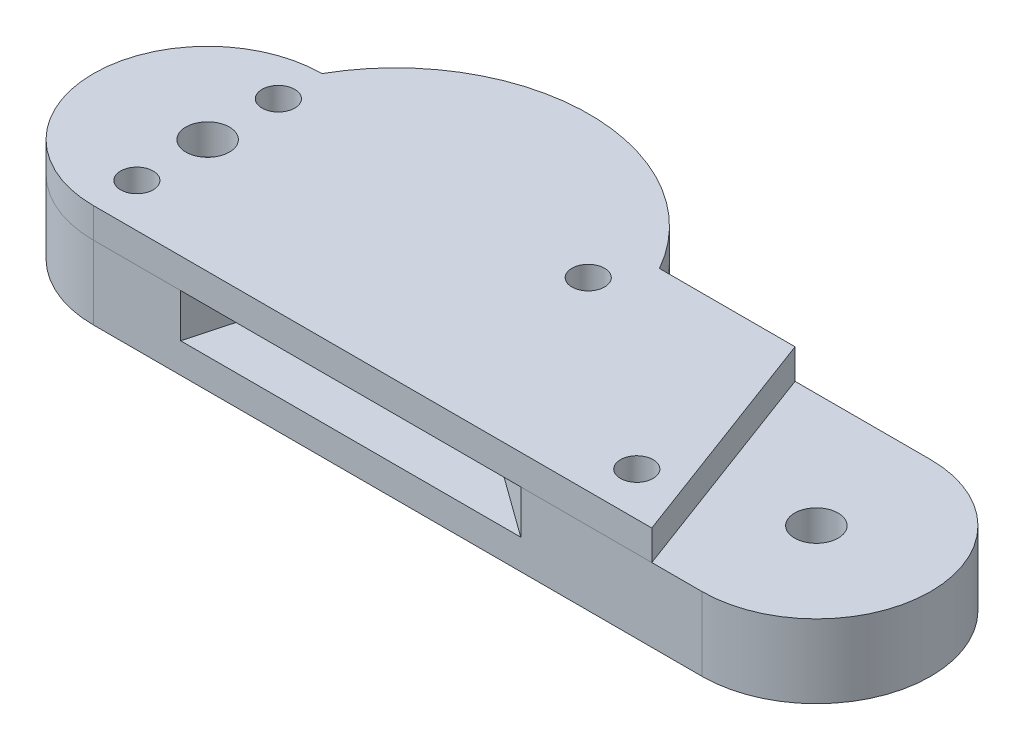
ISO-10303-21;
HEADER;
FILE_DESCRIPTION(('STEP AP214'),'2;1');
FILE_NAME('part.step','',(''),(''),'','','');
FILE_SCHEMA(('AUTOMOTIVE_DESIGN { 1 0 10303 214 1 1 1 1 }'));
ENDSEC;
DATA;
#1=APPLICATION_CONTEXT('core data for automotive mechanical design processes');
#2=APPLICATION_PROTOCOL_DEFINITION('international standard','automotive_design',2000,#1);
#3=PRODUCT_CONTEXT('',#1,'mechanical');
#4=PRODUCT('Part','Part','',(#3));
#5=PRODUCT_RELATED_PRODUCT_CATEGORY('part','',(#4));
#6=PRODUCT_DEFINITION_FORMATION('','',#4);
#7=PRODUCT_DEFINITION_CONTEXT('part definition',#1,'design');
#8=PRODUCT_DEFINITION('design','',#6,#7);
#9=PRODUCT_DEFINITION_SHAPE('','',#8);
#10=(LENGTH_UNIT() NAMED_UNIT(*) SI_UNIT(.MILLI.,.METRE.));
#11=(NAMED_UNIT(*) PLANE_ANGLE_UNIT() SI_UNIT($,.RADIAN.));
#12=(NAMED_UNIT(*) SI_UNIT($,.STERADIAN.) SOLID_ANGLE_UNIT());
#13=UNCERTAINTY_MEASURE_WITH_UNIT(LENGTH_MEASURE(1.E-05),#10,'distance_accuracy_value','');
#14=(GEOMETRIC_REPRESENTATION_CONTEXT(3) GLOBAL_UNCERTAINTY_ASSIGNED_CONTEXT((#13)) GLOBAL_UNIT_ASSIGNED_CONTEXT((#10,
#11,#12)) REPRESENTATION_CONTEXT('',''));
#15=CARTESIAN_POINT('',(0.,0.,0.));
#16=DIRECTION('',(0.,0.,1.));
#17=DIRECTION('',(1.,0.,0.));
#18=AXIS2_PLACEMENT_3D('',#15,#16,#17);
#19=CARTESIAN_POINT('',(0.,2.,0.));
#20=DIRECTION('',(0.,-1.,0.));
#21=DIRECTION('',(0.,0.,-1.));
#22=AXIS2_PLACEMENT_3D('',#19,#20,#21);
#23=PLANE('',#22);
#24=CARTESIAN_POINT('',(-40.4241193156667,2.,-1.7460511013579));
#25=DIRECTION('',(0.,1.,0.));
#26=DIRECTION('',(0.,0.,1.));
#27=AXIS2_PLACEMENT_3D('',#24,#25,#26);
#28=CIRCLE('',#27,17.8069548217708);
#29=CARTESIAN_POINT('',(-24.917700351162,2.,-10.5003992165423));
#30=VERTEX_POINT('',#29);
#31=CARTESIAN_POINT('',(-55.9305382801715,2.,-10.5003992165423));
#32=VERTEX_POINT('',#31);
#33=EDGE_CURVE('E153',#30,#32,#28,.T.);
#34=ORIENTED_EDGE('',*,*,#33,.F.);
#35=DIRECTION('',(1.,0.,0.));
#36=VECTOR('',#35,1.);
#37=CARTESIAN_POINT('',(0.,2.,-10.5003992165423));
#38=LINE('',#37,#36);
#39=CARTESIAN_POINT('',(-12.458850175581,2.,-10.5003992165423));
#40=VERTEX_POINT('',#39);
#41=EDGE_CURVE('E118',#30,#40,#38,.T.);
#42=ORIENTED_EDGE('',*,*,#41,.T.);
#43=DIRECTION('',(-0.349715205744596,0.,-0.93685605877905));
#44=VECTOR('',#43,1.);
#45=CARTESIAN_POINT('',(-12.458850175581,2.,-10.5003992165423));
#46=LINE('',#45,#44);
#47=CARTESIAN_POINT('',(-4.6195471407067,2.,10.5003992165423));
#48=VERTEX_POINT('',#47);
#49=EDGE_CURVE('E103',#48,#40,#46,.T.);
#50=ORIENTED_EDGE('',*,*,#49,.F.);
#51=DIRECTION('',(1.,0.,0.));
#52=VECTOR('',#51,1.);
#53=CARTESIAN_POINT('',(0.,2.,10.5003992165423));
#54=LINE('',#53,#52);
#55=CARTESIAN_POINT('',(-55.9305382801715,2.,10.5003992165423));
#56=VERTEX_POINT('',#55);
#57=EDGE_CURVE('E97',#56,#48,#54,.T.);
#58=ORIENTED_EDGE('',*,*,#57,.F.);
#59=CARTESIAN_POINT('',(-55.9305382801715,2.,0.));
#60=DIRECTION('',(0.,-1.,0.));
#61=DIRECTION('',(0.,0.,-1.));
#62=AXIS2_PLACEMENT_3D('',#59,#60,#61);
#63=CIRCLE('',#62,10.5003992165423);
#64=EDGE_CURVE('E101',#56,#32,#63,.T.);
#65=ORIENTED_EDGE('',*,*,#64,.T.);
#66=EDGE_LOOP('',(#34,#42,#50,#58,#65));
#67=FACE_BOUND('',#66,.T.);
#68=CARTESIAN_POINT('',(-55.9305382801715,2.,6.5003992165423));
#69=DIRECTION('',(0.,-1.,0.));
#70=DIRECTION('',(0.,0.,-1.));
#71=AXIS2_PLACEMENT_3D('',#68,#69,#70);
#72=CIRCLE('',#71,1.5);
#73=CARTESIAN_POINT('',(-55.9305382801715,2.,5.0003992165423));
#74=VERTEX_POINT('',#73);
#75=EDGE_CURVE('E126',#74,#74,#72,.F.);
#76=ORIENTED_EDGE('',*,*,#75,.T.);
#77=EDGE_LOOP('',(#76));
#78=FACE_BOUND('',#77,.T.);
#79=CARTESIAN_POINT('',(-55.9305382801715,2.,0.));
#80=DIRECTION('',(0.,-1.,0.));
#81=DIRECTION('',(0.,0.,-1.));
#82=AXIS2_PLACEMENT_3D('',#79,#80,#81);
#83=CIRCLE('',#82,2.);
#84=CARTESIAN_POINT('',(-55.9305382801715,2.,-2.));
#85=VERTEX_POINT('',#84);
#86=EDGE_CURVE('E106',#85,#85,#83,.T.);
#87=ORIENTED_EDGE('',*,*,#86,.F.);
#88=EDGE_LOOP('',(#87));
#89=FACE_BOUND('',#88,.T.);
#90=CARTESIAN_POINT('',(-55.9305382801715,2.,-6.5003992165423));
#91=DIRECTION('',(0.,-1.,0.));
#92=DIRECTION('',(0.,0.,-1.));
#93=AXIS2_PLACEMENT_3D('',#90,#91,#92);
#94=CIRCLE('',#93,1.5);
#95=CARTESIAN_POINT('',(-55.9305382801715,2.,-8.00039921654231));
#96=VERTEX_POINT('',#95);
#97=EDGE_CURVE('E120',#96,#96,#94,.F.);
#98=ORIENTED_EDGE('',*,*,#97,.T.);
#99=EDGE_LOOP('',(#98));
#100=FACE_BOUND('',#99,.T.);
#101=CARTESIAN_POINT('',(-27.4615510728353,2.,-6.5003992165423));
#102=DIRECTION('',(0.,-1.,0.));
#103=DIRECTION('',(0.,0.,-1.));
#104=AXIS2_PLACEMENT_3D('',#101,#102,#103);
#105=CIRCLE('',#104,1.5);
#106=CARTESIAN_POINT('',(-27.4615510728353,2.,-8.00039921654231));
#107=VERTEX_POINT('',#106);
#108=EDGE_CURVE('E132',#107,#107,#105,.F.);
#109=ORIENTED_EDGE('',*,*,#108,.T.);
#110=EDGE_LOOP('',(#109));
#111=FACE_BOUND('',#110,.T.);
#112=CARTESIAN_POINT('',(-10.,2.,6.5003992165423));
#113=DIRECTION('',(0.,-1.,0.));
#114=DIRECTION('',(0.,0.,-1.));
#115=AXIS2_PLACEMENT_3D('',#112,#113,#114);
#116=CIRCLE('',#115,1.5);
#117=CARTESIAN_POINT('',(-10.,2.,5.0003992165423));
#118=VERTEX_POINT('',#117);
#119=EDGE_CURVE('E129',#118,#118,#116,.F.);
#120=ORIENTED_EDGE('',*,*,#119,.T.);
#121=EDGE_LOOP('',(#120));
#122=FACE_BOUND('',#121,.T.);
#123=ADVANCED_FACE('F52',(#67,#78,#89,#100,#111,#122),#23,.T.);
#124=CARTESIAN_POINT('',(0.,4.75,10.5003992165423));
#125=DIRECTION('',(0.,0.,-1.));
#126=DIRECTION('',(-1.,0.,0.));
#127=AXIS2_PLACEMENT_3D('',#124,#125,#126);
#128=PLANE('',#127);
#129=ORIENTED_EDGE('',*,*,#57,.T.);
#130=DIRECTION('',(0.,1.,0.));
#131=VECTOR('',#130,1.);
#132=CARTESIAN_POINT('',(-4.6195471407067,-29.1152802892206,10.5003992165423));
#133=LINE('',#132,#131);
#134=CARTESIAN_POINT('',(-4.6195471407067,4.75,10.5003992165423));
#135=VERTEX_POINT('',#134);
#136=EDGE_CURVE('E137',#48,#135,#133,.T.);
#137=ORIENTED_EDGE('',*,*,#136,.T.);
#138=DIRECTION('',(1.,0.,0.));
#139=VECTOR('',#138,1.);
#140=CARTESIAN_POINT('',(0.,4.75,10.5003992165423));
#141=LINE('',#140,#139);
#142=CARTESIAN_POINT('',(-55.9305382801715,4.75,10.5003992165423));
#143=VERTEX_POINT('',#142);
#144=EDGE_CURVE('E113',#143,#135,#141,.T.);
#145=ORIENTED_EDGE('',*,*,#144,.F.);
#146=DIRECTION('',(0.,-1.,0.));
#147=VECTOR('',#146,1.);
#148=CARTESIAN_POINT('',(-55.9305382801715,4.75,10.5003992165423));
#149=LINE('',#148,#147);
#150=EDGE_CURVE('E110',#143,#56,#149,.T.);
#151=ORIENTED_EDGE('',*,*,#150,.T.);
#152=EDGE_LOOP('',(#129,#137,#145,#151));
#153=FACE_BOUND('',#152,.T.);
#154=ADVANCED_FACE('F111',(#153),#128,.F.);
#155=CARTESIAN_POINT('',(0.,4.75,0.));
#156=DIRECTION('',(0.,1.,0.));
#157=DIRECTION('',(0.,0.,1.));
#158=AXIS2_PLACEMENT_3D('',#155,#156,#157);
#159=PLANE('',#158);
#160=DIRECTION('',(0.349715205744595,0.,0.93685605877905));
#161=VECTOR('',#160,1.);
#162=CARTESIAN_POINT('',(-12.458850175581,4.75,-10.5003992165423));
#163=LINE('',#162,#161);
#164=CARTESIAN_POINT('',(-12.458850175581,4.75,-10.5003992165423));
#165=VERTEX_POINT('',#164);
#166=EDGE_CURVE('E13',#165,#135,#163,.T.);
#167=ORIENTED_EDGE('',*,*,#166,.F.);
#168=DIRECTION('',(-1.,0.,0.));
#169=VECTOR('',#168,1.);
#170=CARTESIAN_POINT('',(0.,4.75,-10.5003992165423));
#171=LINE('',#170,#169);
#172=CARTESIAN_POINT('',(-24.917700351162,4.75,-10.5003992165423));
#173=VERTEX_POINT('',#172);
#174=EDGE_CURVE('E161',#165,#173,#171,.T.);
#175=ORIENTED_EDGE('',*,*,#174,.T.);
#176=CARTESIAN_POINT('',(-40.4241193156667,4.75,-1.7460511013579));
#177=DIRECTION('',(0.,1.,0.));
#178=DIRECTION('',(0.,0.,1.));
#179=AXIS2_PLACEMENT_3D('',#176,#177,#178);
#180=CIRCLE('',#179,17.8069548217708);
#181=CARTESIAN_POINT('',(-55.9305382801715,4.75,-10.5003992165423));
#182=VERTEX_POINT('',#181);
#183=EDGE_CURVE('E155',#173,#182,#180,.T.);
#184=ORIENTED_EDGE('',*,*,#183,.T.);
#185=CARTESIAN_POINT('',(-55.9305382801715,4.75,0.));
#186=DIRECTION('',(0.,1.,0.));
#187=DIRECTION('',(0.,0.,1.));
#188=AXIS2_PLACEMENT_3D('',#185,#186,#187);
#189=CIRCLE('',#188,10.5003992165423);
#190=EDGE_CURVE('E163',#182,#143,#189,.T.);
#191=ORIENTED_EDGE('',*,*,#190,.T.);
#192=ORIENTED_EDGE('',*,*,#144,.T.);
#193=EDGE_LOOP('',(#167,#175,#184,#191,#192));
#194=FACE_BOUND('',#193,.T.);
#195=CARTESIAN_POINT('',(-55.9305382801715,4.75,-6.5003992165423));
#196=DIRECTION('',(0.,-1.,0.));
#197=DIRECTION('',(0.,0.,-1.));
#198=AXIS2_PLACEMENT_3D('',#195,#196,#197);
#199=CIRCLE('',#198,1.5);
#200=CARTESIAN_POINT('',(-55.9305382801715,4.75,-8.00039921654231));
#201=VERTEX_POINT('',#200);
#202=EDGE_CURVE('E138',#201,#201,#199,.T.);
#203=ORIENTED_EDGE('',*,*,#202,.T.);
#204=EDGE_LOOP('',(#203));
#205=FACE_BOUND('',#204,.T.);
#206=CARTESIAN_POINT('',(-55.9305382801715,4.75,6.5003992165423));
#207=DIRECTION('',(0.,-1.,0.));
#208=DIRECTION('',(0.,0.,-1.));
#209=AXIS2_PLACEMENT_3D('',#206,#207,#208);
#210=CIRCLE('',#209,1.5);
#211=CARTESIAN_POINT('',(-55.9305382801715,4.75,5.0003992165423));
#212=VERTEX_POINT('',#211);
#213=EDGE_CURVE('E145',#212,#212,#210,.T.);
#214=ORIENTED_EDGE('',*,*,#213,.T.);
#215=EDGE_LOOP('',(#214));
#216=FACE_BOUND('',#215,.T.);
#217=CARTESIAN_POINT('',(-10.,4.75,6.5003992165423));
#218=DIRECTION('',(0.,-1.,0.));
#219=DIRECTION('',(0.,0.,-1.));
#220=AXIS2_PLACEMENT_3D('',#217,#218,#219);
#221=CIRCLE('',#220,1.5);
#222=CARTESIAN_POINT('',(-10.,4.75,5.0003992165423));
#223=VERTEX_POINT('',#222);
#224=EDGE_CURVE('E142',#223,#223,#221,.T.);
#225=ORIENTED_EDGE('',*,*,#224,.T.);
#226=EDGE_LOOP('',(#225));
#227=FACE_BOUND('',#226,.T.);
#228=CARTESIAN_POINT('',(-27.4615510728353,4.75,-6.5003992165423));
#229=DIRECTION('',(0.,-1.,0.));
#230=DIRECTION('',(0.,0.,-1.));
#231=AXIS2_PLACEMENT_3D('',#228,#229,#230);
#232=CIRCLE('',#231,1.5);
#233=CARTESIAN_POINT('',(-27.4615510728353,4.75,-8.00039921654231));
#234=VERTEX_POINT('',#233);
#235=EDGE_CURVE('E146',#234,#234,#232,.T.);
#236=ORIENTED_EDGE('',*,*,#235,.T.);
#237=EDGE_LOOP('',(#236));
#238=FACE_BOUND('',#237,.T.);
#239=CARTESIAN_POINT('',(-55.9305382801715,4.75,0.));
#240=DIRECTION('',(0.,1.,0.));
#241=DIRECTION('',(0.,0.,1.));
#242=AXIS2_PLACEMENT_3D('',#239,#240,#241);
#243=CIRCLE('',#242,2.);
#244=CARTESIAN_POINT('',(-55.9305382801715,4.75,2.));
#245=VERTEX_POINT('',#244);
#246=EDGE_CURVE('E158',#245,#245,#243,.T.);
#247=ORIENTED_EDGE('',*,*,#246,.F.);
#248=EDGE_LOOP('',(#247));
#249=FACE_BOUND('',#248,.T.);
#250=ADVANCED_FACE('F166',(#194,#205,#216,#227,#238,#249),#159,.T.);
#251=CARTESIAN_POINT('',(0.,4.75,-10.5003992165423));
#252=DIRECTION('',(0.,0.,1.));
#253=DIRECTION('',(1.,0.,0.));
#254=AXIS2_PLACEMENT_3D('',#251,#252,#253);
#255=PLANE('',#254);
#256=ORIENTED_EDGE('',*,*,#41,.F.);
#257=DIRECTION('',(0.,-1.,0.));
#258=VECTOR('',#257,1.);
#259=CARTESIAN_POINT('',(-24.917700351162,37.0570550282,-10.5003992165423));
#260=LINE('',#259,#258);
#261=EDGE_CURVE('E56',#173,#30,#260,.T.);
#262=ORIENTED_EDGE('',*,*,#261,.F.);
#263=ORIENTED_EDGE('',*,*,#174,.F.);
#264=DIRECTION('',(0.,1.,0.));
#265=VECTOR('',#264,1.);
#266=CARTESIAN_POINT('',(-12.458850175581,-29.1152802892206,-10.5003992165423));
#267=LINE('',#266,#265);
#268=EDGE_CURVE('E61',#40,#165,#267,.T.);
#269=ORIENTED_EDGE('',*,*,#268,.F.);
#270=EDGE_LOOP('',(#256,#262,#263,#269));
#271=FACE_BOUND('',#270,.T.);
#272=ADVANCED_FACE('F176',(#271),#255,.F.);
#273=CARTESIAN_POINT('',(-12.458850175581,-29.1152802892206,-10.5003992165423));
#274=DIRECTION('',(-0.93685605877905,0.,0.349715205744596));
#275=DIRECTION('',(0.349715205744596,0.,0.93685605877905));
#276=AXIS2_PLACEMENT_3D('',#273,#274,#275);
#277=PLANE('',#276);
#278=ORIENTED_EDGE('',*,*,#49,.T.);
#279=ORIENTED_EDGE('',*,*,#268,.T.);
#280=ORIENTED_EDGE('',*,*,#166,.T.);
#281=ORIENTED_EDGE('',*,*,#136,.F.);
#282=EDGE_LOOP('',(#278,#279,#280,#281));
#283=FACE_BOUND('',#282,.T.);
#284=ADVANCED_FACE('F178',(#283),#277,.F.);
#285=CARTESIAN_POINT('',(-55.9305382801715,4.75,0.));
#286=DIRECTION('',(0.,-1.,0.));
#287=DIRECTION('',(0.,0.,-1.));
#288=AXIS2_PLACEMENT_3D('',#285,#286,#287);
#289=CYLINDRICAL_SURFACE('',#288,10.5003992165423);
#290=ORIENTED_EDGE('',*,*,#64,.F.);
#291=ORIENTED_EDGE('',*,*,#150,.F.);
#292=ORIENTED_EDGE('',*,*,#190,.F.);
#293=DIRECTION('',(0.,-1.,0.));
#294=VECTOR('',#293,1.);
#295=CARTESIAN_POINT('',(-55.9305382801715,4.75,-10.5003992165423));
#296=LINE('',#295,#294);
#297=EDGE_CURVE('E105',#182,#32,#296,.T.);
#298=ORIENTED_EDGE('',*,*,#297,.T.);
#299=EDGE_LOOP('',(#290,#291,#292,#298));
#300=FACE_BOUND('',#299,.T.);
#301=ADVANCED_FACE('F117',(#300),#289,.T.);
#302=CARTESIAN_POINT('',(-40.4241193156667,37.0570550282,-1.7460511013579));
#303=DIRECTION('',(0.,-1.,0.));
#304=DIRECTION('',(0.,0.,-1.));
#305=AXIS2_PLACEMENT_3D('',#302,#303,#304);
#306=CYLINDRICAL_SURFACE('',#305,17.8069548217708);
#307=ORIENTED_EDGE('',*,*,#261,.T.);
#308=ORIENTED_EDGE('',*,*,#33,.T.);
#309=ORIENTED_EDGE('',*,*,#297,.F.);
#310=ORIENTED_EDGE('',*,*,#183,.F.);
#311=EDGE_LOOP('',(#307,#308,#309,#310));
#312=FACE_BOUND('',#311,.T.);
#313=ADVANCED_FACE('F173',(#312),#306,.T.);
#314=CARTESIAN_POINT('',(-55.9305382801715,4.75,0.));
#315=DIRECTION('',(0.,-1.,0.));
#316=DIRECTION('',(0.,0.,-1.));
#317=AXIS2_PLACEMENT_3D('',#314,#315,#316);
#318=CYLINDRICAL_SURFACE('',#317,2.);
#319=ORIENTED_EDGE('',*,*,#246,.T.);
#320=EDGE_LOOP('',(#319));
#321=FACE_BOUND('',#320,.T.);
#322=ORIENTED_EDGE('',*,*,#86,.T.);
#323=EDGE_LOOP('',(#322));
#324=FACE_BOUND('',#323,.T.);
#325=ADVANCED_FACE('F194',(#321,#324),#318,.F.);
#326=CARTESIAN_POINT('',(-55.9305382801715,4.75,-6.5003992165423));
#327=DIRECTION('',(0.,-1.,0.));
#328=DIRECTION('',(0.,0.,-1.));
#329=AXIS2_PLACEMENT_3D('',#326,#327,#328);
#330=CYLINDRICAL_SURFACE('',#329,1.5);
#331=ORIENTED_EDGE('',*,*,#202,.F.);
#332=EDGE_LOOP('',(#331));
#333=FACE_BOUND('',#332,.T.);
#334=ORIENTED_EDGE('',*,*,#97,.F.);
#335=EDGE_LOOP('',(#334));
#336=FACE_BOUND('',#335,.T.);
#337=ADVANCED_FACE('F197',(#333,#336),#330,.F.);
#338=CARTESIAN_POINT('',(-55.9305382801715,4.75,6.5003992165423));
#339=DIRECTION('',(0.,-1.,0.));
#340=DIRECTION('',(0.,0.,-1.));
#341=AXIS2_PLACEMENT_3D('',#338,#339,#340);
#342=CYLINDRICAL_SURFACE('',#341,1.5);
#343=ORIENTED_EDGE('',*,*,#213,.F.);
#344=EDGE_LOOP('',(#343));
#345=FACE_BOUND('',#344,.T.);
#346=ORIENTED_EDGE('',*,*,#75,.F.);
#347=EDGE_LOOP('',(#346));
#348=FACE_BOUND('',#347,.T.);
#349=ADVANCED_FACE('F201',(#345,#348),#342,.F.);
#350=CARTESIAN_POINT('',(-10.,4.75,6.5003992165423));
#351=DIRECTION('',(0.,-1.,0.));
#352=DIRECTION('',(0.,0.,-1.));
#353=AXIS2_PLACEMENT_3D('',#350,#351,#352);
#354=CYLINDRICAL_SURFACE('',#353,1.5);
#355=ORIENTED_EDGE('',*,*,#224,.F.);
#356=EDGE_LOOP('',(#355));
#357=FACE_BOUND('',#356,.T.);
#358=ORIENTED_EDGE('',*,*,#119,.F.);
#359=EDGE_LOOP('',(#358));
#360=FACE_BOUND('',#359,.T.);
#361=ADVANCED_FACE('F204',(#357,#360),#354,.F.);
#362=CARTESIAN_POINT('',(-27.4615510728353,4.75,-6.5003992165423));
#363=DIRECTION('',(0.,-1.,0.));
#364=DIRECTION('',(0.,0.,-1.));
#365=AXIS2_PLACEMENT_3D('',#362,#363,#364);
#366=CYLINDRICAL_SURFACE('',#365,1.5);
#367=ORIENTED_EDGE('',*,*,#235,.F.);
#368=EDGE_LOOP('',(#367));
#369=FACE_BOUND('',#368,.T.);
#370=ORIENTED_EDGE('',*,*,#108,.F.);
#371=EDGE_LOOP('',(#370));
#372=FACE_BOUND('',#371,.T.);
#373=ADVANCED_FACE('F54',(#369,#372),#366,.F.);
#374=CLOSED_SHELL('',(#123,#154,#250,#272,#284,#301,#313,#325,#337,#349,#361,#373));
#375=MANIFOLD_SOLID_BREP('B2',#374);
#376=CARTESIAN_POINT('',(0.,2.,0.));
#377=DIRECTION('',(0.,-1.,0.));
#378=DIRECTION('',(0.,0.,-1.));
#379=AXIS2_PLACEMENT_3D('',#376,#377,#378);
#380=PLANE('',#379);
#381=CARTESIAN_POINT('',(-55.9305382801715,2.,-6.5003992165423));
#382=DIRECTION('',(0.,-1.,0.));
#383=DIRECTION('',(0.,0.,-1.));
#384=AXIS2_PLACEMENT_3D('',#381,#382,#383);
#385=CIRCLE('',#384,1.5);
#386=CARTESIAN_POINT('',(-55.9305382801715,2.,-8.00039921654231));
#387=VERTEX_POINT('',#386);
#388=EDGE_CURVE('E475',#387,#387,#385,.F.);
#389=ORIENTED_EDGE('',*,*,#388,.F.);
#390=EDGE_LOOP('',(#389));
#391=FACE_BOUND('',#390,.T.);
#392=CARTESIAN_POINT('',(-55.9305382801715,2.,0.));
#393=DIRECTION('',(0.,-1.,0.));
#394=DIRECTION('',(0.,0.,-1.));
#395=AXIS2_PLACEMENT_3D('',#392,#393,#394);
#396=CIRCLE('',#395,2.);
#397=CARTESIAN_POINT('',(-55.9305382801715,2.,-2.));
#398=VERTEX_POINT('',#397);
#399=EDGE_CURVE('E50',#398,#398,#396,.T.);
#400=ORIENTED_EDGE('',*,*,#399,.T.);
#401=EDGE_LOOP('',(#400));
#402=FACE_BOUND('',#401,.T.);
#403=CARTESIAN_POINT('',(-55.9305382801715,2.,0.));
#404=DIRECTION('',(0.,-1.,0.));
#405=DIRECTION('',(0.,0.,-1.));
#406=AXIS2_PLACEMENT_3D('',#403,#404,#405);
#407=CIRCLE('',#406,10.5003992165423);
#408=CARTESIAN_POINT('',(-55.9305382801715,2.,10.5003992165423));
#409=VERTEX_POINT('',#408);
#410=CARTESIAN_POINT('',(-55.9305382801715,2.,-10.5003992165423));
#411=VERTEX_POINT('',#410);
#412=EDGE_CURVE('E446',#409,#411,#407,.T.);
#413=ORIENTED_EDGE('',*,*,#412,.F.);
#414=DIRECTION('',(-1.,0.,0.));
#415=VECTOR('',#414,1.);
#416=CARTESIAN_POINT('',(0.,2.,10.5003992165423));
#417=LINE('',#416,#415);
#418=CARTESIAN_POINT('',(-47.9106890267398,2.,10.5003992165423));
#419=VERTEX_POINT('',#418);
#420=EDGE_CURVE('E469',#419,#409,#417,.T.);
#421=ORIENTED_EDGE('',*,*,#420,.F.);
#422=DIRECTION('',(-0.263153614525289,0.,0.964753945398657));
#423=VECTOR('',#422,1.);
#424=CARTESIAN_POINT('',(-43.8872651072943,2.,-4.24997427651618));
#425=LINE('',#424,#423);
#426=CARTESIAN_POINT('',(-43.8872651072943,2.,-4.24997427651618));
#427=VERTEX_POINT('',#426);
#428=EDGE_CURVE('E782',#427,#419,#425,.T.);
#429=ORIENTED_EDGE('',*,*,#428,.F.);
#430=DIRECTION('',(0.810372315489383,0.,0.585915275691269));
#431=VECTOR('',#430,1.);
#432=CARTESIAN_POINT('',(-43.8872651072943,2.,-4.24997427651618));
#433=LINE('',#432,#431);
#434=CARTESIAN_POINT('',(-54.8543825263999,2.,-12.1794179449777));
#435=VERTEX_POINT('',#434);
#436=EDGE_CURVE('E799',#435,#427,#433,.T.);
#437=ORIENTED_EDGE('',*,*,#436,.F.);
#438=CARTESIAN_POINT('',(-40.4241193156667,2.,-1.7460511013579));
#439=DIRECTION('',(0.,-1.,0.));
#440=DIRECTION('',(0.,0.,-1.));
#441=AXIS2_PLACEMENT_3D('',#438,#439,#440);
#442=CIRCLE('',#441,17.8069548217708);
#443=EDGE_CURVE('E343',#411,#435,#442,.T.);
#444=ORIENTED_EDGE('',*,*,#443,.F.);
#445=EDGE_LOOP('',(#413,#421,#429,#437,#444));
#446=FACE_BOUND('',#445,.T.);
#447=CARTESIAN_POINT('',(-55.9305382801715,2.,6.5003992165423));
#448=DIRECTION('',(0.,-1.,0.));
#449=DIRECTION('',(0.,0.,-1.));
#450=AXIS2_PLACEMENT_3D('',#447,#448,#449);
#451=CIRCLE('',#450,1.5);
#452=CARTESIAN_POINT('',(-55.9305382801715,2.,5.0003992165423));
#453=VERTEX_POINT('',#452);
#454=EDGE_CURVE('E481',#453,#453,#451,.F.);
#455=ORIENTED_EDGE('',*,*,#454,.F.);
#456=EDGE_LOOP('',(#455));
#457=FACE_BOUND('',#456,.T.);
#458=ADVANCED_FACE('F319',(#391,#402,#446,#457),#380,.F.);
#459=CARTESIAN_POINT('',(-41.5933955268113,2.,-5.05946240908561));
#460=DIRECTION('',(0.,1.,0.));
#461=DIRECTION('',(0.,0.,1.));
#462=AXIS2_PLACEMENT_3D('',#459,#460,#461);
#463=PLANE('',#462);
#464=CARTESIAN_POINT('',(0.,2.,0.));
#465=DIRECTION('',(0.,1.,0.));
#466=DIRECTION('',(0.,0.,1.));
#467=AXIS2_PLACEMENT_3D('',#464,#465,#466);
#468=CIRCLE('',#467,2.);
#469=CARTESIAN_POINT('',(0.,2.,2.));
#470=VERTEX_POINT('',#469);
#471=EDGE_CURVE('E421',#470,#470,#468,.T.);
#472=ORIENTED_EDGE('',*,*,#471,.F.);
#473=EDGE_LOOP('',(#472));
#474=FACE_BOUND('',#473,.T.);
#475=DIRECTION('',(1.,0.,0.));
#476=VECTOR('',#475,1.);
#477=CARTESIAN_POINT('',(-12.458850175581,2.,-10.5003992165423));
#478=LINE('',#477,#476);
#479=CARTESIAN_POINT('',(-24.917700351162,2.,-10.5003992165423));
#480=VERTEX_POINT('',#479);
#481=CARTESIAN_POINT('',(0.,2.,-10.5003992165423));
#482=VERTEX_POINT('',#481);
#483=EDGE_CURVE('E335',#480,#482,#478,.T.);
#484=ORIENTED_EDGE('',*,*,#483,.F.);
#485=CARTESIAN_POINT('',(-35.7381547906292,2.,-18.9253810211969));
#486=VERTEX_POINT('',#485);
#487=EDGE_CURVE('E472',#486,#480,#442,.T.);
#488=ORIENTED_EDGE('',*,*,#487,.F.);
#489=DIRECTION('',(0.263153614525288,0.,-0.964753945398658));
#490=VECTOR('',#489,1.);
#491=CARTESIAN_POINT('',(-35.7518279113757,2.,-18.8752536565782));
#492=LINE('',#491,#490);
#493=CARTESIAN_POINT('',(-39.2995259463282,2.,-5.86895054165502));
#494=VERTEX_POINT('',#493);
#495=EDGE_CURVE('E796',#494,#486,#492,.T.);
#496=ORIENTED_EDGE('',*,*,#495,.F.);
#497=DIRECTION('',(-0.810372315489383,0.,-0.585915275691269));
#498=VECTOR('',#497,1.);
#499=CARTESIAN_POINT('',(26.6452391554762,2.,41.8104240945407));
#500=LINE('',#499,#498);
#501=CARTESIAN_POINT('',(-16.659276720951,2.,10.5003992165423));
#502=VERTEX_POINT('',#501);
#503=EDGE_CURVE('E777',#502,#494,#500,.T.);
#504=ORIENTED_EDGE('',*,*,#503,.F.);
#505=DIRECTION('',(-1.,0.,0.));
#506=VECTOR('',#505,1.);
#507=CARTESIAN_POINT('',(-4.6195471407067,2.,10.5003992165423));
#508=LINE('',#507,#506);
#509=CARTESIAN_POINT('',(0.,2.,10.5003992165423));
#510=VERTEX_POINT('',#509);
#511=EDGE_CURVE('E407',#510,#502,#508,.T.);
#512=ORIENTED_EDGE('',*,*,#511,.F.);
#513=CARTESIAN_POINT('',(0.,2.,0.));
#514=DIRECTION('',(0.,1.,0.));
#515=DIRECTION('',(0.,0.,1.));
#516=AXIS2_PLACEMENT_3D('',#513,#514,#515);
#517=CIRCLE('',#516,10.5003992165423);
#518=EDGE_CURVE('E403',#482,#510,#517,.F.);
#519=ORIENTED_EDGE('',*,*,#518,.F.);
#520=EDGE_LOOP('',(#484,#488,#496,#504,#512,#519));
#521=FACE_BOUND('',#520,.T.);
#522=CARTESIAN_POINT('',(-10.,2.,6.5003992165423));
#523=DIRECTION('',(0.,-1.,0.));
#524=DIRECTION('',(0.,0.,-1.));
#525=AXIS2_PLACEMENT_3D('',#522,#523,#524);
#526=CIRCLE('',#525,1.5);
#527=CARTESIAN_POINT('',(-10.,2.,5.0003992165423));
#528=VERTEX_POINT('',#527);
#529=EDGE_CURVE('E484',#528,#528,#526,.F.);
#530=ORIENTED_EDGE('',*,*,#529,.F.);
#531=EDGE_LOOP('',(#530));
#532=FACE_BOUND('',#531,.T.);
#533=CARTESIAN_POINT('',(-27.4615510728353,2.,-6.5003992165423));
#534=DIRECTION('',(0.,-1.,0.));
#535=DIRECTION('',(0.,0.,-1.));
#536=AXIS2_PLACEMENT_3D('',#533,#534,#535);
#537=CIRCLE('',#536,1.5);
#538=CARTESIAN_POINT('',(-27.4615510728353,2.,-8.00039921654231));
#539=VERTEX_POINT('',#538);
#540=EDGE_CURVE('E322',#539,#539,#537,.F.);
#541=ORIENTED_EDGE('',*,*,#540,.F.);
#542=EDGE_LOOP('',(#541));
#543=FACE_BOUND('',#542,.T.);
#544=ADVANCED_FACE('F404',(#474,#521,#532,#543),#463,.T.);
#545=CARTESIAN_POINT('',(-55.9305382801715,-1.55,6.5003992165423));
#546=DIRECTION('',(0.,-1.,0.));
#547=DIRECTION('',(0.,0.,-1.));
#548=AXIS2_PLACEMENT_3D('',#545,#546,#547);
#549=CYLINDRICAL_SURFACE('',#548,2.75);
#550=CARTESIAN_POINT('',(-55.9305382801715,-1.55,6.5003992165423));
#551=DIRECTION('',(0.,-1.,0.));
#552=DIRECTION('',(0.,0.,-1.));
#553=AXIS2_PLACEMENT_3D('',#550,#551,#552);
#554=CIRCLE('',#553,2.75);
#555=CARTESIAN_POINT('',(-55.9305382801715,-1.55,3.7503992165423));
#556=VERTEX_POINT('',#555);
#557=EDGE_CURVE('E452',#556,#556,#554,.T.);
#558=ORIENTED_EDGE('',*,*,#557,.F.);
#559=EDGE_LOOP('',(#558));
#560=FACE_BOUND('',#559,.T.);
#561=CARTESIAN_POINT('',(-55.9305382801715,-4.75,6.5003992165423));
#562=DIRECTION('',(0.,-1.,0.));
#563=DIRECTION('',(0.,0.,-1.));
#564=AXIS2_PLACEMENT_3D('',#561,#562,#563);
#565=CIRCLE('',#564,2.75);
#566=CARTESIAN_POINT('',(-55.9305382801715,-4.75,3.7503992165423));
#567=VERTEX_POINT('',#566);
#568=EDGE_CURVE('E755',#567,#567,#565,.T.);
#569=ORIENTED_EDGE('',*,*,#568,.T.);
#570=EDGE_LOOP('',(#569));
#571=FACE_BOUND('',#570,.T.);
#572=ADVANCED_FACE('F497',(#560,#571),#549,.F.);
#573=CARTESIAN_POINT('',(-55.9305382801715,-1.55,-6.5003992165423));
#574=DIRECTION('',(0.,-1.,0.));
#575=DIRECTION('',(0.,0.,-1.));
#576=AXIS2_PLACEMENT_3D('',#573,#574,#575);
#577=CYLINDRICAL_SURFACE('',#576,2.75);
#578=CARTESIAN_POINT('',(-55.9305382801715,-1.55,-6.5003992165423));
#579=DIRECTION('',(0.,-1.,0.));
#580=DIRECTION('',(0.,0.,-1.));
#581=AXIS2_PLACEMENT_3D('',#578,#579,#580);
#582=CIRCLE('',#581,2.75);
#583=CARTESIAN_POINT('',(-55.9305382801715,-1.55,-9.2503992165423));
#584=VERTEX_POINT('',#583);
#585=EDGE_CURVE('E759',#584,#584,#582,.T.);
#586=ORIENTED_EDGE('',*,*,#585,.F.);
#587=EDGE_LOOP('',(#586));
#588=FACE_BOUND('',#587,.T.);
#589=CARTESIAN_POINT('',(-55.9305382801715,-4.75,-6.5003992165423));
#590=DIRECTION('',(0.,-1.,0.));
#591=DIRECTION('',(0.,0.,-1.));
#592=AXIS2_PLACEMENT_3D('',#589,#590,#591);
#593=CIRCLE('',#592,2.75);
#594=CARTESIAN_POINT('',(-55.9305382801715,-4.75,-9.2503992165423));
#595=VERTEX_POINT('',#594);
#596=EDGE_CURVE('E857',#595,#595,#593,.T.);
#597=ORIENTED_EDGE('',*,*,#596,.T.);
#598=EDGE_LOOP('',(#597));
#599=FACE_BOUND('',#598,.T.);
#600=ADVANCED_FACE('F504',(#588,#599),#577,.F.);
#601=CARTESIAN_POINT('',(-27.4615510728353,-1.55,-6.5003992165423));
#602=DIRECTION('',(0.,-1.,0.));
#603=DIRECTION('',(0.,0.,-1.));
#604=AXIS2_PLACEMENT_3D('',#601,#602,#603);
#605=CYLINDRICAL_SURFACE('',#604,2.75);
#606=CARTESIAN_POINT('',(-27.4615510728353,-1.55,-6.5003992165423));
#607=DIRECTION('',(0.,-1.,0.));
#608=DIRECTION('',(0.,0.,-1.));
#609=AXIS2_PLACEMENT_3D('',#606,#607,#608);
#610=CIRCLE('',#609,2.75);
#611=CARTESIAN_POINT('',(-27.4615510728353,-1.55,-9.2503992165423));
#612=VERTEX_POINT('',#611);
#613=EDGE_CURVE('E861',#612,#612,#610,.T.);
#614=ORIENTED_EDGE('',*,*,#613,.F.);
#615=EDGE_LOOP('',(#614));
#616=FACE_BOUND('',#615,.T.);
#617=CARTESIAN_POINT('',(-27.4615510728353,-4.75,-6.5003992165423));
#618=DIRECTION('',(0.,-1.,0.));
#619=DIRECTION('',(0.,0.,-1.));
#620=AXIS2_PLACEMENT_3D('',#617,#618,#619);
#621=CIRCLE('',#620,2.75);
#622=CARTESIAN_POINT('',(-27.4615510728353,-4.75,-9.2503992165423));
#623=VERTEX_POINT('',#622);
#624=EDGE_CURVE('E748',#623,#623,#621,.T.);
#625=ORIENTED_EDGE('',*,*,#624,.T.);
#626=EDGE_LOOP('',(#625));
#627=FACE_BOUND('',#626,.T.);
#628=ADVANCED_FACE('F644',(#616,#627),#605,.F.);
#629=CARTESIAN_POINT('',(-10.,-1.55,6.5003992165423));
#630=DIRECTION('',(0.,-1.,0.));
#631=DIRECTION('',(0.,0.,-1.));
#632=AXIS2_PLACEMENT_3D('',#629,#630,#631);
#633=CYLINDRICAL_SURFACE('',#632,2.75);
#634=CARTESIAN_POINT('',(-10.,-1.55,6.5003992165423));
#635=DIRECTION('',(0.,-1.,0.));
#636=DIRECTION('',(0.,0.,-1.));
#637=AXIS2_PLACEMENT_3D('',#634,#635,#636);
#638=CIRCLE('',#637,2.75);
#639=CARTESIAN_POINT('',(-10.,-1.55,3.7503992165423));
#640=VERTEX_POINT('',#639);
#641=EDGE_CURVE('E742',#640,#640,#638,.T.);
#642=ORIENTED_EDGE('',*,*,#641,.F.);
#643=EDGE_LOOP('',(#642));
#644=FACE_BOUND('',#643,.T.);
#645=CARTESIAN_POINT('',(-10.,-4.75,6.5003992165423));
#646=DIRECTION('',(0.,-1.,0.));
#647=DIRECTION('',(0.,0.,-1.));
#648=AXIS2_PLACEMENT_3D('',#645,#646,#647);
#649=CIRCLE('',#648,2.75);
#650=CARTESIAN_POINT('',(-10.,-4.75,3.7503992165423));
#651=VERTEX_POINT('',#650);
#652=EDGE_CURVE('E468',#651,#651,#649,.T.);
#653=ORIENTED_EDGE('',*,*,#652,.T.);
#654=EDGE_LOOP('',(#653));
#655=FACE_BOUND('',#654,.T.);
#656=ADVANCED_FACE('F546',(#644,#655),#633,.F.);
#657=CARTESIAN_POINT('',(-35.7518279113757,-2.,-18.8752536565782));
#658=DIRECTION('',(0.964753945398658,0.,0.263153614525288));
#659=DIRECTION('',(0.263153614525288,0.,-0.964753945398658));
#660=AXIS2_PLACEMENT_3D('',#657,#658,#659);
#661=PLANE('',#660);
#662=DIRECTION('',(0.263153614525288,0.,-0.964753945398658));
#663=VECTOR('',#662,1.);
#664=CARTESIAN_POINT('',(-35.7518279113757,-2.,-18.8752536565782));
#665=LINE('',#664,#663);
#666=CARTESIAN_POINT('',(-39.2995259463282,-2.,-5.86895054165502));
#667=VERTEX_POINT('',#666);
#668=CARTESIAN_POINT('',(-35.7381547906292,-2.,-18.9253810211969));
#669=VERTEX_POINT('',#668);
#670=EDGE_CURVE('E781',#667,#669,#665,.T.);
#671=ORIENTED_EDGE('',*,*,#670,.F.);
#672=DIRECTION('',(0.,1.,0.));
#673=VECTOR('',#672,1.);
#674=CARTESIAN_POINT('',(-39.2995259463282,-2.,-5.86895054165502));
#675=LINE('',#674,#673);
#676=EDGE_CURVE('E792',#667,#494,#675,.T.);
#677=ORIENTED_EDGE('',*,*,#676,.T.);
#678=ORIENTED_EDGE('',*,*,#495,.T.);
#679=DIRECTION('',(0.,1.,0.));
#680=VECTOR('',#679,1.);
#681=CARTESIAN_POINT('',(-35.7381547906292,-2.,-18.9253810211969));
#682=LINE('',#681,#680);
#683=EDGE_CURVE('E763',#669,#486,#682,.T.);
#684=ORIENTED_EDGE('',*,*,#683,.F.);
#685=EDGE_LOOP('',(#671,#677,#678,#684));
#686=FACE_BOUND('',#685,.T.);
#687=ADVANCED_FACE('F527',(#686),#661,.F.);
#688=CARTESIAN_POINT('',(-40.4241193156667,37.0570550282,-1.7460511013579));
#689=DIRECTION('',(0.,-1.,0.));
#690=DIRECTION('',(0.,0.,-1.));
#691=AXIS2_PLACEMENT_3D('',#688,#689,#690);
#692=CYLINDRICAL_SURFACE('',#691,17.8069548217708);
#693=ORIENTED_EDGE('',*,*,#683,.T.);
#694=ORIENTED_EDGE('',*,*,#487,.T.);
#695=DIRECTION('',(0.,-1.,0.));
#696=VECTOR('',#695,1.);
#697=CARTESIAN_POINT('',(-24.917700351162,37.0570550282,-10.5003992165423));
#698=LINE('',#697,#696);
#699=CARTESIAN_POINT('',(-24.917700351162,-4.75,-10.5003992165423));
#700=VERTEX_POINT('',#699);
#701=EDGE_CURVE('E419',#480,#700,#698,.T.);
#702=ORIENTED_EDGE('',*,*,#701,.T.);
#703=CARTESIAN_POINT('',(-40.4241193156667,-4.75,-1.7460511013579));
#704=DIRECTION('',(0.,1.,0.));
#705=DIRECTION('',(0.,0.,1.));
#706=AXIS2_PLACEMENT_3D('',#703,#704,#705);
#707=CIRCLE('',#706,17.8069548217708);
#708=CARTESIAN_POINT('',(-55.9305382801715,-4.75,-10.5003992165423));
#709=VERTEX_POINT('',#708);
#710=EDGE_CURVE('E768',#709,#700,#707,.F.);
#711=ORIENTED_EDGE('',*,*,#710,.F.);
#712=DIRECTION('',(0.,-1.,0.));
#713=VECTOR('',#712,1.);
#714=CARTESIAN_POINT('',(-55.9305382801715,4.75,-10.5003992165423));
#715=LINE('',#714,#713);
#716=EDGE_CURVE('E429',#411,#709,#715,.T.);
#717=ORIENTED_EDGE('',*,*,#716,.F.);
#718=ORIENTED_EDGE('',*,*,#443,.T.);
#719=DIRECTION('',(0.,1.,0.));
#720=VECTOR('',#719,1.);
#721=CARTESIAN_POINT('',(-54.8543825263999,-2.,-12.1794179449777));
#722=LINE('',#721,#720);
#723=CARTESIAN_POINT('',(-54.8543825263999,-2.,-12.1794179449777));
#724=VERTEX_POINT('',#723);
#725=EDGE_CURVE('E764',#724,#435,#722,.T.);
#726=ORIENTED_EDGE('',*,*,#725,.F.);
#727=CARTESIAN_POINT('',(-40.4241193156667,-2.,-1.7460511013579));
#728=DIRECTION('',(0.,1.,0.));
#729=DIRECTION('',(0.,0.,1.));
#730=AXIS2_PLACEMENT_3D('',#727,#728,#729);
#731=CIRCLE('',#730,17.8069548217708);
#732=EDGE_CURVE('E464',#669,#724,#731,.T.);
#733=ORIENTED_EDGE('',*,*,#732,.F.);
#734=EDGE_LOOP('',(#693,#694,#702,#711,#717,#718,#726,#733));
#735=FACE_BOUND('',#734,.T.);
#736=ADVANCED_FACE('F523',(#735),#692,.T.);
#737=CARTESIAN_POINT('',(-55.9305382801715,4.75,0.));
#738=DIRECTION('',(0.,-1.,0.));
#739=DIRECTION('',(0.,0.,-1.));
#740=AXIS2_PLACEMENT_3D('',#737,#738,#739);
#741=CYLINDRICAL_SURFACE('',#740,10.5003992165423);
#742=DIRECTION('',(0.,-1.,0.));
#743=VECTOR('',#742,1.);
#744=CARTESIAN_POINT('',(-55.9305382801715,4.75,10.5003992165423));
#745=LINE('',#744,#743);
#746=CARTESIAN_POINT('',(-55.9305382801715,-4.75,10.5003992165423));
#747=VERTEX_POINT('',#746);
#748=EDGE_CURVE('E436',#409,#747,#745,.T.);
#749=ORIENTED_EDGE('',*,*,#748,.F.);
#750=ORIENTED_EDGE('',*,*,#412,.T.);
#751=ORIENTED_EDGE('',*,*,#716,.T.);
#752=CARTESIAN_POINT('',(-55.9305382801715,-4.75,0.));
#753=DIRECTION('',(0.,1.,0.));
#754=DIRECTION('',(0.,0.,1.));
#755=AXIS2_PLACEMENT_3D('',#752,#753,#754);
#756=CIRCLE('',#755,10.5003992165423);
#757=EDGE_CURVE('E824',#709,#747,#756,.T.);
#758=ORIENTED_EDGE('',*,*,#757,.T.);
#759=EDGE_LOOP('',(#749,#750,#751,#758));
#760=FACE_BOUND('',#759,.T.);
#761=ADVANCED_FACE('F526',(#760),#741,.T.);
#762=CARTESIAN_POINT('',(-43.8872651072943,-2.,-4.24997427651618));
#763=DIRECTION('',(-0.964753945398657,0.,-0.263153614525289));
#764=DIRECTION('',(-0.263153614525289,0.,0.964753945398657));
#765=AXIS2_PLACEMENT_3D('',#762,#763,#764);
#766=PLANE('',#765);
#767=DIRECTION('',(-0.263153614525289,0.,0.964753945398657));
#768=VECTOR('',#767,1.);
#769=CARTESIAN_POINT('',(-43.8872651072943,-2.,-4.24997427651618));
#770=LINE('',#769,#768);
#771=CARTESIAN_POINT('',(-43.8872651072943,-2.,-4.24997427651618));
#772=VERTEX_POINT('',#771);
#773=CARTESIAN_POINT('',(-47.9106890267398,-2.,10.5003992165423));
#774=VERTEX_POINT('',#773);
#775=EDGE_CURVE('E788',#772,#774,#770,.T.);
#776=ORIENTED_EDGE('',*,*,#775,.F.);
#777=DIRECTION('',(0.,1.,0.));
#778=VECTOR('',#777,1.);
#779=CARTESIAN_POINT('',(-43.8872651072943,-2.,-4.24997427651618));
#780=LINE('',#779,#778);
#781=EDGE_CURVE('E804',#772,#427,#780,.T.);
#782=ORIENTED_EDGE('',*,*,#781,.T.);
#783=ORIENTED_EDGE('',*,*,#428,.T.);
#784=DIRECTION('',(0.,1.,0.));
#785=VECTOR('',#784,1.);
#786=CARTESIAN_POINT('',(-47.9106890267398,4.75,10.5003992165423));
#787=LINE('',#786,#785);
#788=EDGE_CURVE('E428',#774,#419,#787,.T.);
#789=ORIENTED_EDGE('',*,*,#788,.F.);
#790=EDGE_LOOP('',(#776,#782,#783,#789));
#791=FACE_BOUND('',#790,.T.);
#792=ADVANCED_FACE('F533',(#791),#766,.F.);
#793=CARTESIAN_POINT('',(-41.5933955268113,-2.,-5.05946240908561));
#794=DIRECTION('',(0.,1.,0.));
#795=DIRECTION('',(0.,0.,1.));
#796=AXIS2_PLACEMENT_3D('',#793,#794,#795);
#797=PLANE('',#796);
#798=ORIENTED_EDGE('',*,*,#670,.T.);
#799=ORIENTED_EDGE('',*,*,#732,.T.);
#800=DIRECTION('',(0.810372315489383,0.,0.585915275691269));
#801=VECTOR('',#800,1.);
#802=CARTESIAN_POINT('',(-43.8872651072943,-2.,-4.24997427651618));
#803=LINE('',#802,#801);
#804=EDGE_CURVE('E785',#724,#772,#803,.T.);
#805=ORIENTED_EDGE('',*,*,#804,.T.);
#806=ORIENTED_EDGE('',*,*,#775,.T.);
#807=DIRECTION('',(1.,0.,0.));
#808=VECTOR('',#807,1.);
#809=CARTESIAN_POINT('',(0.,-2.,10.5003992165423));
#810=LINE('',#809,#808);
#811=CARTESIAN_POINT('',(-16.659276720951,-2.,10.5003992165423));
#812=VERTEX_POINT('',#811);
#813=EDGE_CURVE('E443',#774,#812,#810,.T.);
#814=ORIENTED_EDGE('',*,*,#813,.T.);
#815=DIRECTION('',(-0.810372315489383,0.,-0.585915275691269));
#816=VECTOR('',#815,1.);
#817=CARTESIAN_POINT('',(26.6452391554762,-2.,41.8104240945407));
#818=LINE('',#817,#816);
#819=EDGE_CURVE('E778',#812,#667,#818,.T.);
#820=ORIENTED_EDGE('',*,*,#819,.T.);
#821=EDGE_LOOP('',(#798,#799,#805,#806,#814,#820));
#822=FACE_BOUND('',#821,.T.);
#823=ADVANCED_FACE('F529',(#822),#797,.T.);
#824=CARTESIAN_POINT('',(26.6452391554762,-2.,41.8104240945407));
#825=DIRECTION('',(0.585915275691269,0.,-0.810372315489383));
#826=DIRECTION('',(-0.810372315489383,0.,-0.585915275691269));
#827=AXIS2_PLACEMENT_3D('',#824,#825,#826);
#828=PLANE('',#827);
#829=ORIENTED_EDGE('',*,*,#503,.T.);
#830=ORIENTED_EDGE('',*,*,#676,.F.);
#831=ORIENTED_EDGE('',*,*,#819,.F.);
#832=DIRECTION('',(0.,-1.,0.));
#833=VECTOR('',#832,1.);
#834=CARTESIAN_POINT('',(-16.659276720951,4.75,10.5003992165423));
#835=LINE('',#834,#833);
#836=EDGE_CURVE('E434',#502,#812,#835,.T.);
#837=ORIENTED_EDGE('',*,*,#836,.F.);
#838=EDGE_LOOP('',(#829,#830,#831,#837));
#839=FACE_BOUND('',#838,.T.);
#840=ADVANCED_FACE('F532',(#839),#828,.F.);
#841=CARTESIAN_POINT('',(0.,4.75,-10.5003992165423));
#842=DIRECTION('',(0.,0.,1.));
#843=DIRECTION('',(1.,0.,0.));
#844=AXIS2_PLACEMENT_3D('',#841,#842,#843);
#845=PLANE('',#844);
#846=ORIENTED_EDGE('',*,*,#701,.F.);
#847=ORIENTED_EDGE('',*,*,#483,.T.);
#848=DIRECTION('',(0.,-1.,0.));
#849=VECTOR('',#848,1.);
#850=CARTESIAN_POINT('',(0.,4.75,-10.5003992165423));
#851=LINE('',#850,#849);
#852=CARTESIAN_POINT('',(0.,-4.75,-10.5003992165423));
#853=VERTEX_POINT('',#852);
#854=EDGE_CURVE('E417',#482,#853,#851,.T.);
#855=ORIENTED_EDGE('',*,*,#854,.T.);
#856=DIRECTION('',(-1.,0.,0.));
#857=VECTOR('',#856,1.);
#858=CARTESIAN_POINT('',(0.,-4.75,-10.5003992165423));
#859=LINE('',#858,#857);
#860=EDGE_CURVE('E821',#853,#700,#859,.T.);
#861=ORIENTED_EDGE('',*,*,#860,.T.);
#862=EDGE_LOOP('',(#846,#847,#855,#861));
#863=FACE_BOUND('',#862,.T.);
#864=ADVANCED_FACE('F415',(#863),#845,.F.);
#865=CARTESIAN_POINT('',(0.,-4.75,0.));
#866=DIRECTION('',(0.,1.,0.));
#867=DIRECTION('',(0.,0.,1.));
#868=AXIS2_PLACEMENT_3D('',#865,#866,#867);
#869=PLANE('',#868);
#870=ORIENTED_EDGE('',*,*,#652,.F.);
#871=EDGE_LOOP('',(#870));
#872=FACE_BOUND('',#871,.T.);
#873=ORIENTED_EDGE('',*,*,#624,.F.);
#874=EDGE_LOOP('',(#873));
#875=FACE_BOUND('',#874,.T.);
#876=ORIENTED_EDGE('',*,*,#596,.F.);
#877=EDGE_LOOP('',(#876));
#878=FACE_BOUND('',#877,.T.);
#879=ORIENTED_EDGE('',*,*,#568,.F.);
#880=EDGE_LOOP('',(#879));
#881=FACE_BOUND('',#880,.T.);
#882=CARTESIAN_POINT('',(0.,-4.75,0.));
#883=DIRECTION('',(0.,1.,0.));
#884=DIRECTION('',(0.,0.,1.));
#885=AXIS2_PLACEMENT_3D('',#882,#883,#884);
#886=CIRCLE('',#885,10.5003992165423);
#887=CARTESIAN_POINT('',(0.,-4.75,10.5003992165423));
#888=VERTEX_POINT('',#887);
#889=EDGE_CURVE('E426',#888,#853,#886,.T.);
#890=ORIENTED_EDGE('',*,*,#889,.F.);
#891=DIRECTION('',(1.,0.,0.));
#892=VECTOR('',#891,1.);
#893=CARTESIAN_POINT('',(0.,-4.75,10.5003992165423));
#894=LINE('',#893,#892);
#895=EDGE_CURVE('E828',#747,#888,#894,.T.);
#896=ORIENTED_EDGE('',*,*,#895,.F.);
#897=ORIENTED_EDGE('',*,*,#757,.F.);
#898=ORIENTED_EDGE('',*,*,#710,.T.);
#899=ORIENTED_EDGE('',*,*,#860,.F.);
#900=EDGE_LOOP('',(#890,#896,#897,#898,#899));
#901=FACE_BOUND('',#900,.T.);
#902=CARTESIAN_POINT('',(0.,-4.75,0.));
#903=DIRECTION('',(0.,1.,0.));
#904=DIRECTION('',(0.,0.,1.));
#905=AXIS2_PLACEMENT_3D('',#902,#903,#904);
#906=CIRCLE('',#905,2.);
#907=CARTESIAN_POINT('',(0.,-4.75,2.));
#908=VERTEX_POINT('',#907);
#909=EDGE_CURVE('E815',#908,#908,#906,.T.);
#910=ORIENTED_EDGE('',*,*,#909,.T.);
#911=EDGE_LOOP('',(#910));
#912=FACE_BOUND('',#911,.T.);
#913=CARTESIAN_POINT('',(-55.9305382801715,-4.75,0.));
#914=DIRECTION('',(0.,1.,0.));
#915=DIRECTION('',(0.,0.,1.));
#916=AXIS2_PLACEMENT_3D('',#913,#914,#915);
#917=CIRCLE('',#916,2.);
#918=CARTESIAN_POINT('',(-55.9305382801715,-4.75,2.));
#919=VERTEX_POINT('',#918);
#920=EDGE_CURVE('E808',#919,#919,#917,.T.);
#921=ORIENTED_EDGE('',*,*,#920,.T.);
#922=EDGE_LOOP('',(#921));
#923=FACE_BOUND('',#922,.T.);
#924=ADVANCED_FACE('F558',(#872,#875,#878,#881,#901,#912,#923),#869,.F.);
#925=CARTESIAN_POINT('',(0.,4.75,10.5003992165423));
#926=DIRECTION('',(0.,0.,-1.));
#927=DIRECTION('',(-1.,0.,0.));
#928=AXIS2_PLACEMENT_3D('',#925,#926,#927);
#929=PLANE('',#928);
#930=ORIENTED_EDGE('',*,*,#511,.T.);
#931=ORIENTED_EDGE('',*,*,#836,.T.);
#932=ORIENTED_EDGE('',*,*,#813,.F.);
#933=ORIENTED_EDGE('',*,*,#788,.T.);
#934=ORIENTED_EDGE('',*,*,#420,.T.);
#935=ORIENTED_EDGE('',*,*,#748,.T.);
#936=ORIENTED_EDGE('',*,*,#895,.T.);
#937=DIRECTION('',(0.,-1.,0.));
#938=VECTOR('',#937,1.);
#939=CARTESIAN_POINT('',(0.,4.75,10.5003992165423));
#940=LINE('',#939,#938);
#941=EDGE_CURVE('E832',#510,#888,#940,.T.);
#942=ORIENTED_EDGE('',*,*,#941,.F.);
#943=EDGE_LOOP('',(#930,#931,#932,#933,#934,#935,#936,#942));
#944=FACE_BOUND('',#943,.T.);
#945=ADVANCED_FACE('F561',(#944),#929,.F.);
#946=CARTESIAN_POINT('',(0.,4.75,0.));
#947=DIRECTION('',(0.,-1.,0.));
#948=DIRECTION('',(0.,0.,-1.));
#949=AXIS2_PLACEMENT_3D('',#946,#947,#948);
#950=CYLINDRICAL_SURFACE('',#949,10.5003992165423);
#951=ORIENTED_EDGE('',*,*,#518,.T.);
#952=ORIENTED_EDGE('',*,*,#941,.T.);
#953=ORIENTED_EDGE('',*,*,#889,.T.);
#954=ORIENTED_EDGE('',*,*,#854,.F.);
#955=EDGE_LOOP('',(#951,#952,#953,#954));
#956=FACE_BOUND('',#955,.T.);
#957=ADVANCED_FACE('F424',(#956),#950,.T.);
#958=CARTESIAN_POINT('',(0.,4.75,0.));
#959=DIRECTION('',(0.,-1.,0.));
#960=DIRECTION('',(0.,0.,-1.));
#961=AXIS2_PLACEMENT_3D('',#958,#959,#960);
#962=CYLINDRICAL_SURFACE('',#961,2.);
#963=ORIENTED_EDGE('',*,*,#909,.F.);
#964=EDGE_LOOP('',(#963));
#965=FACE_BOUND('',#964,.T.);
#966=ORIENTED_EDGE('',*,*,#471,.T.);
#967=EDGE_LOOP('',(#966));
#968=FACE_BOUND('',#967,.T.);
#969=ADVANCED_FACE('F542',(#965,#968),#962,.F.);
#970=CARTESIAN_POINT('',(-43.8872651072943,-2.,-4.24997427651618));
#971=DIRECTION('',(-0.585915275691269,0.,0.810372315489383));
#972=DIRECTION('',(0.810372315489383,0.,0.585915275691269));
#973=AXIS2_PLACEMENT_3D('',#970,#971,#972);
#974=PLANE('',#973);
#975=ORIENTED_EDGE('',*,*,#436,.T.);
#976=ORIENTED_EDGE('',*,*,#781,.F.);
#977=ORIENTED_EDGE('',*,*,#804,.F.);
#978=ORIENTED_EDGE('',*,*,#725,.T.);
#979=EDGE_LOOP('',(#975,#976,#977,#978));
#980=FACE_BOUND('',#979,.T.);
#981=ADVANCED_FACE('F538',(#980),#974,.F.);
#982=CARTESIAN_POINT('',(-55.9305382801715,4.75,0.));
#983=DIRECTION('',(0.,-1.,0.));
#984=DIRECTION('',(0.,0.,-1.));
#985=AXIS2_PLACEMENT_3D('',#982,#983,#984);
#986=CYLINDRICAL_SURFACE('',#985,2.);
#987=ORIENTED_EDGE('',*,*,#399,.F.);
#988=EDGE_LOOP('',(#987));
#989=FACE_BOUND('',#988,.T.);
#990=ORIENTED_EDGE('',*,*,#920,.F.);
#991=EDGE_LOOP('',(#990));
#992=FACE_BOUND('',#991,.T.);
#993=ADVANCED_FACE('F541',(#989,#992),#986,.F.);
#994=CARTESIAN_POINT('',(-55.9305382801715,-1.55,-6.5003992165423));
#995=DIRECTION('',(0.,-1.,0.));
#996=DIRECTION('',(0.,0.,-1.));
#997=AXIS2_PLACEMENT_3D('',#994,#995,#996);
#998=PLANE('',#997);
#999=ORIENTED_EDGE('',*,*,#585,.T.);
#1000=EDGE_LOOP('',(#999));
#1001=FACE_BOUND('',#1000,.T.);
#1002=CARTESIAN_POINT('',(-55.9305382801715,-1.55,-6.5003992165423));
#1003=DIRECTION('',(0.,-1.,0.));
#1004=DIRECTION('',(0.,0.,-1.));
#1005=AXIS2_PLACEMENT_3D('',#1002,#1003,#1004);
#1006=CIRCLE('',#1005,1.5);
#1007=CARTESIAN_POINT('',(-55.9305382801715,-1.55,-8.00039921654231));
#1008=VERTEX_POINT('',#1007);
#1009=EDGE_CURVE('E447',#1008,#1008,#1006,.F.);
#1010=ORIENTED_EDGE('',*,*,#1009,.T.);
#1011=EDGE_LOOP('',(#1010));
#1012=FACE_BOUND('',#1011,.T.);
#1013=ADVANCED_FACE('F553',(#1001,#1012),#998,.T.);
#1014=CARTESIAN_POINT('',(-55.9305382801715,4.75,-6.5003992165423));
#1015=DIRECTION('',(0.,-1.,0.));
#1016=DIRECTION('',(0.,0.,-1.));
#1017=AXIS2_PLACEMENT_3D('',#1014,#1015,#1016);
#1018=CYLINDRICAL_SURFACE('',#1017,1.5);
#1019=ORIENTED_EDGE('',*,*,#388,.T.);
#1020=EDGE_LOOP('',(#1019));
#1021=FACE_BOUND('',#1020,.T.);
#1022=ORIENTED_EDGE('',*,*,#1009,.F.);
#1023=EDGE_LOOP('',(#1022));
#1024=FACE_BOUND('',#1023,.T.);
#1025=ADVANCED_FACE('F521',(#1021,#1024),#1018,.F.);
#1026=CARTESIAN_POINT('',(-55.9305382801715,-1.55,6.5003992165423));
#1027=DIRECTION('',(0.,-1.,0.));
#1028=DIRECTION('',(0.,0.,-1.));
#1029=AXIS2_PLACEMENT_3D('',#1026,#1027,#1028);
#1030=PLANE('',#1029);
#1031=ORIENTED_EDGE('',*,*,#557,.T.);
#1032=EDGE_LOOP('',(#1031));
#1033=FACE_BOUND('',#1032,.T.);
#1034=CARTESIAN_POINT('',(-55.9305382801715,-1.55,6.5003992165423));
#1035=DIRECTION('',(0.,-1.,0.));
#1036=DIRECTION('',(0.,0.,-1.));
#1037=AXIS2_PLACEMENT_3D('',#1034,#1035,#1036);
#1038=CIRCLE('',#1037,1.5);
#1039=CARTESIAN_POINT('',(-55.9305382801715,-1.55,5.0003992165423));
#1040=VERTEX_POINT('',#1039);
#1041=EDGE_CURVE('E451',#1040,#1040,#1038,.F.);
#1042=ORIENTED_EDGE('',*,*,#1041,.T.);
#1043=EDGE_LOOP('',(#1042));
#1044=FACE_BOUND('',#1043,.T.);
#1045=ADVANCED_FACE('F602',(#1033,#1044),#1030,.T.);
#1046=CARTESIAN_POINT('',(-55.9305382801715,4.75,6.5003992165423));
#1047=DIRECTION('',(0.,-1.,0.));
#1048=DIRECTION('',(0.,0.,-1.));
#1049=AXIS2_PLACEMENT_3D('',#1046,#1047,#1048);
#1050=CYLINDRICAL_SURFACE('',#1049,1.5);
#1051=ORIENTED_EDGE('',*,*,#454,.T.);
#1052=EDGE_LOOP('',(#1051));
#1053=FACE_BOUND('',#1052,.T.);
#1054=ORIENTED_EDGE('',*,*,#1041,.F.);
#1055=EDGE_LOOP('',(#1054));
#1056=FACE_BOUND('',#1055,.T.);
#1057=ADVANCED_FACE('F610',(#1053,#1056),#1050,.F.);
#1058=CARTESIAN_POINT('',(-10.,-1.55,6.5003992165423));
#1059=DIRECTION('',(0.,-1.,0.));
#1060=DIRECTION('',(0.,0.,-1.));
#1061=AXIS2_PLACEMENT_3D('',#1058,#1059,#1060);
#1062=PLANE('',#1061);
#1063=ORIENTED_EDGE('',*,*,#641,.T.);
#1064=EDGE_LOOP('',(#1063));
#1065=FACE_BOUND('',#1064,.T.);
#1066=CARTESIAN_POINT('',(-10.,-1.55,6.5003992165423));
#1067=DIRECTION('',(0.,-1.,0.));
#1068=DIRECTION('',(0.,0.,-1.));
#1069=AXIS2_PLACEMENT_3D('',#1066,#1067,#1068);
#1070=CIRCLE('',#1069,1.5);
#1071=CARTESIAN_POINT('',(-10.,-1.55,5.0003992165423));
#1072=VERTEX_POINT('',#1071);
#1073=EDGE_CURVE('E456',#1072,#1072,#1070,.F.);
#1074=ORIENTED_EDGE('',*,*,#1073,.T.);
#1075=EDGE_LOOP('',(#1074));
#1076=FACE_BOUND('',#1075,.T.);
#1077=ADVANCED_FACE('F620',(#1065,#1076),#1062,.T.);
#1078=CARTESIAN_POINT('',(-10.,4.75,6.5003992165423));
#1079=DIRECTION('',(0.,-1.,0.));
#1080=DIRECTION('',(0.,0.,-1.));
#1081=AXIS2_PLACEMENT_3D('',#1078,#1079,#1080);
#1082=CYLINDRICAL_SURFACE('',#1081,1.5);
#1083=ORIENTED_EDGE('',*,*,#529,.T.);
#1084=EDGE_LOOP('',(#1083));
#1085=FACE_BOUND('',#1084,.T.);
#1086=ORIENTED_EDGE('',*,*,#1073,.F.);
#1087=EDGE_LOOP('',(#1086));
#1088=FACE_BOUND('',#1087,.T.);
#1089=ADVANCED_FACE('F516',(#1085,#1088),#1082,.F.);
#1090=CARTESIAN_POINT('',(-27.4615510728353,-1.55,-6.5003992165423));
#1091=DIRECTION('',(0.,-1.,0.));
#1092=DIRECTION('',(0.,0.,-1.));
#1093=AXIS2_PLACEMENT_3D('',#1090,#1091,#1092);
#1094=PLANE('',#1093);
#1095=ORIENTED_EDGE('',*,*,#613,.T.);
#1096=EDGE_LOOP('',(#1095));
#1097=FACE_BOUND('',#1096,.T.);
#1098=CARTESIAN_POINT('',(-27.4615510728353,-1.55,-6.5003992165423));
#1099=DIRECTION('',(0.,-1.,0.));
#1100=DIRECTION('',(0.,0.,-1.));
#1101=AXIS2_PLACEMENT_3D('',#1098,#1099,#1100);
#1102=CIRCLE('',#1101,1.5);
#1103=CARTESIAN_POINT('',(-27.4615510728353,-1.55,-8.00039921654231));
#1104=VERTEX_POINT('',#1103);
#1105=EDGE_CURVE('E460',#1104,#1104,#1102,.F.);
#1106=ORIENTED_EDGE('',*,*,#1105,.T.);
#1107=EDGE_LOOP('',(#1106));
#1108=FACE_BOUND('',#1107,.T.);
#1109=ADVANCED_FACE('F511',(#1097,#1108),#1094,.T.);
#1110=CARTESIAN_POINT('',(-27.4615510728353,4.75,-6.5003992165423));
#1111=DIRECTION('',(0.,-1.,0.));
#1112=DIRECTION('',(0.,0.,-1.));
#1113=AXIS2_PLACEMENT_3D('',#1110,#1111,#1112);
#1114=CYLINDRICAL_SURFACE('',#1113,1.5);
#1115=ORIENTED_EDGE('',*,*,#540,.T.);
#1116=EDGE_LOOP('',(#1115));
#1117=FACE_BOUND('',#1116,.T.);
#1118=ORIENTED_EDGE('',*,*,#1105,.F.);
#1119=EDGE_LOOP('',(#1118));
#1120=FACE_BOUND('',#1119,.T.);
#1121=ADVANCED_FACE('F493',(#1117,#1120),#1114,.F.);
#1122=CLOSED_SHELL('',(#458,#544,#572,#600,#628,#656,#687,#736,#761,#792,#823,#840,#864,#924,
#945,#957,#969,#981,#993,#1013,#1025,#1045,#1057,#1077,#1089,#1109,#1121));
#1123=MANIFOLD_SOLID_BREP('B7',#1122);
#1124=ADVANCED_BREP_SHAPE_REPRESENTATION('',(#18,#375,#1123),#14);
#1125=SHAPE_DEFINITION_REPRESENTATION(#9,#1124);
ENDSEC;
END-ISO-10303-21;
